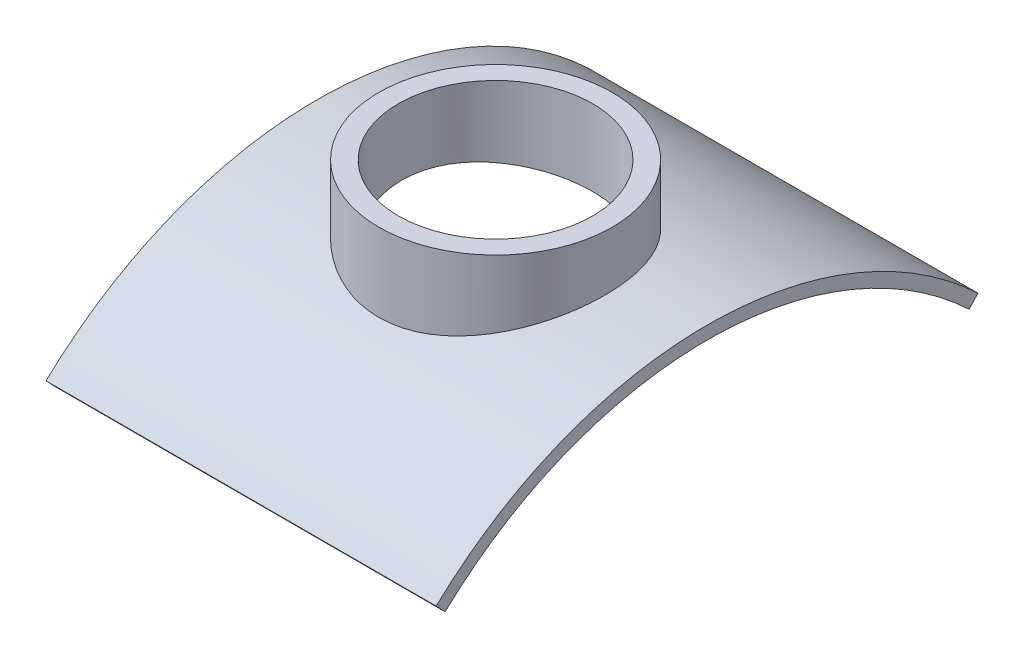
ISO-10303-21;
HEADER;
FILE_DESCRIPTION(('STEP AP214'),'2;1');
FILE_NAME('part.step','',(''),(''),'','','');
FILE_SCHEMA(('AUTOMOTIVE_DESIGN { 1 0 10303 214 1 1 1 1 }'));
ENDSEC;
DATA;
#1=APPLICATION_CONTEXT('core data for automotive mechanical design processes');
#2=APPLICATION_PROTOCOL_DEFINITION('international standard','automotive_design',2000,#1);
#3=PRODUCT_CONTEXT('',#1,'mechanical');
#4=PRODUCT('Part','Part','',(#3));
#5=PRODUCT_RELATED_PRODUCT_CATEGORY('part','',(#4));
#6=PRODUCT_DEFINITION_FORMATION('','',#4);
#7=PRODUCT_DEFINITION_CONTEXT('part definition',#1,'design');
#8=PRODUCT_DEFINITION('design','',#6,#7);
#9=PRODUCT_DEFINITION_SHAPE('','',#8);
#10=(LENGTH_UNIT() NAMED_UNIT(*) SI_UNIT(.MILLI.,.METRE.));
#11=(NAMED_UNIT(*) PLANE_ANGLE_UNIT() SI_UNIT($,.RADIAN.));
#12=(NAMED_UNIT(*) SI_UNIT($,.STERADIAN.) SOLID_ANGLE_UNIT());
#13=UNCERTAINTY_MEASURE_WITH_UNIT(LENGTH_MEASURE(1.E-05),#10,'distance_accuracy_value','');
#14=(GEOMETRIC_REPRESENTATION_CONTEXT(3) GLOBAL_UNCERTAINTY_ASSIGNED_CONTEXT((#13)) GLOBAL_UNIT_ASSIGNED_CONTEXT((#10,
#11,#12)) REPRESENTATION_CONTEXT('',''));
#15=CARTESIAN_POINT('',(0.,0.,0.));
#16=DIRECTION('',(0.,0.,1.));
#17=DIRECTION('',(1.,0.,0.));
#18=AXIS2_PLACEMENT_3D('',#15,#16,#17);
#19=CARTESIAN_POINT('',(-76.2,-55.8967886761865,-12.5367072563237));
#20=DIRECTION('',(1.,0.,0.));
#21=DIRECTION('',(0.,0.,-1.));
#22=AXIS2_PLACEMENT_3D('',#19,#20,#21);
#23=CYLINDRICAL_SURFACE('',#22,74.4279989622607);
#24=CARTESIAN_POINT('',(-37.9311273784649,15.0923870754284,9.82540256436644));
#25=CARTESIAN_POINT('',(-38.4505120344371,15.0923885511749,9.82540037968779));
#26=CARTESIAN_POINT('',(-38.9699386174354,15.099118057699,9.80406909682286));
#27=CARTESIAN_POINT('',(-40.0049848916022,15.1258511632332,9.71893493880602));
#28=CARTESIAN_POINT('',(-40.5206041648063,15.1458561983459,9.65512746871877));
#29=CARTESIAN_POINT('',(-41.5445096050084,15.1985944193553,9.48558610992453));
#30=CARTESIAN_POINT('',(-42.0527919175702,15.2313340597718,9.37983095954742));
#31=CARTESIAN_POINT('',(-43.0581299706054,15.308641800082,9.12734364837541));
#32=CARTESIAN_POINT('',(-43.5551859601273,15.3532096372948,8.98061239757524));
#33=CARTESIAN_POINT('',(-44.533843079493,15.4528961738092,8.64771169589109));
#34=CARTESIAN_POINT('',(-45.0154693640861,15.5079965603796,8.46161063742949));
#35=CARTESIAN_POINT('',(-45.9610188747538,15.6273752836008,8.05131394989079));
#36=CARTESIAN_POINT('',(-46.4249420292329,15.6916536573642,7.8271181667703));
#37=CARTESIAN_POINT('',(-47.3322033191304,15.8277900321173,7.34230665968545));
#38=CARTESIAN_POINT('',(-47.7755406796854,15.8996483180873,7.08168956627621));
#39=CARTESIAN_POINT('',(-48.6389285908967,16.0492127683249,6.52589267372035));
#40=CARTESIAN_POINT('',(-49.0589786620969,16.1269190529178,6.23071216334519));
#41=CARTESIAN_POINT('',(-49.8847538998985,16.2886172229573,5.59898621292399));
#42=CARTESIAN_POINT('',(-50.2897514943191,16.3727240375883,5.26151584603086));
#43=CARTESIAN_POINT('',(-50.874857797633,16.5005691496078,4.73125988836466));
#44=CARTESIAN_POINT('',(-51.0661710729505,16.5434673144236,4.55048930849967));
#45=CARTESIAN_POINT('',(-51.4411307242,16.6295954138362,4.1811458289045));
#46=CARTESIAN_POINT('',(-51.6247752275127,16.6728254264506,3.99257104560874));
#47=CARTESIAN_POINT('',(-52.1636855415677,16.8026227021649,3.4156570699129));
#48=CARTESIAN_POINT('',(-52.5069989707127,16.8893128093795,3.01606405696631));
#49=CARTESIAN_POINT('',(-53.1593911126859,17.0610330022589,2.18950719418521));
#50=CARTESIAN_POINT('',(-53.4684697359047,17.1460630835781,1.76254327271211));
#51=CARTESIAN_POINT('',(-53.9086986762779,17.2720529627238,1.09782169252944));
#52=CARTESIAN_POINT('',(-54.0532468445526,17.3143244279064,0.869089947443553));
#53=CARTESIAN_POINT('',(-54.3324907288905,17.3976871254553,0.405560696303036));
#54=CARTESIAN_POINT('',(-54.467188831338,17.438778642214,0.170764678223352));
#55=CARTESIAN_POINT('',(-54.8561989156189,17.5599536219544,-0.542279814024978));
#56=CARTESIAN_POINT('',(-55.0954515667016,17.6379446922613,-1.02922230745042));
#57=CARTESIAN_POINT('',(-55.5317064927699,17.7865460873568,-2.02264517109605));
#58=CARTESIAN_POINT('',(-55.7287124459112,17.8571570544102,-2.52912383589022));
#59=CARTESIAN_POINT('',(-56.078865446134,17.9894883899983,-3.55817125684371));
#60=CARTESIAN_POINT('',(-56.232013594514,18.0512089817568,-4.0807396086153));
#61=CARTESIAN_POINT('',(-56.490661966092,18.1634464348037,-5.12852526702309));
#62=CARTESIAN_POINT('',(-56.5969778951666,18.2141465983675,-5.65352165714116));
#63=CARTESIAN_POINT('',(-56.7649469985714,18.3048033508456,-6.71153483716751));
#64=CARTESIAN_POINT('',(-56.8266005805439,18.3447600378158,-7.24455155382731));
#65=CARTESIAN_POINT('',(-56.9045650427563,18.4132884767062,-8.31452796166626));
#66=CARTESIAN_POINT('',(-56.9208838522913,18.4418622188156,-8.85148694684651));
#67=CARTESIAN_POINT('',(-56.9079194025465,18.4873265932094,-9.92534575374575));
#68=CARTESIAN_POINT('',(-56.8786371380824,18.5042174803509,-10.4622455764999));
#69=CARTESIAN_POINT('',(-56.7762172578917,18.5260069975981,-11.5153011534834));
#70=CARTESIAN_POINT('',(-56.7044643574971,18.5312604506641,-12.031584818623));
#71=CARTESIAN_POINT('',(-56.5187566866084,18.5311593991978,-13.0564937221246));
#72=CARTESIAN_POINT('',(-56.4048028729502,18.5258051351658,-13.5651191338526));
#73=CARTESIAN_POINT('',(-56.1355354128616,18.5051029316497,-14.5710813614478));
#74=CARTESIAN_POINT('',(-55.9802221407807,18.4897550826168,-15.0684182794442));
#75=CARTESIAN_POINT('',(-55.6293965694005,18.4499398053579,-16.0483270023317));
#76=CARTESIAN_POINT('',(-55.4338839214881,18.4254722980438,-16.5308986791354));
#77=CARTESIAN_POINT('',(-55.0043585850204,18.3685531407903,-17.4774145512233));
#78=CARTESIAN_POINT('',(-54.7703909610917,18.3361108145879,-17.9413797686268));
#79=CARTESIAN_POINT('',(-54.2654838123821,18.2645165389867,-18.8481829077863));
#80=CARTESIAN_POINT('',(-53.9945444348608,18.2253646163123,-19.2910209136832));
#81=CARTESIAN_POINT('',(-53.4175536787451,18.1417858141443,-20.1527401925277));
#82=CARTESIAN_POINT('',(-53.1114982398656,18.0973583246441,-20.5716186867555));
#83=CARTESIAN_POINT('',(-52.466371588776,18.0047825365558,-21.382691898051));
#84=CARTESIAN_POINT('',(-52.1272997585278,17.9566341683196,-21.7748861153786));
#85=CARTESIAN_POINT('',(-51.4099530318163,17.8570700259727,-22.5390750499057));
#86=CARTESIAN_POINT('',(-51.0309386046624,17.8056038217391,-22.9103692849331));
#87=CARTESIAN_POINT('',(-50.243205223572,17.7022460221225,-23.6199244057623));
#88=CARTESIAN_POINT('',(-49.8344858187497,17.6503544202931,-23.9581847899674));
#89=CARTESIAN_POINT('',(-48.9900400720576,17.547907634141,-24.5994215613395));
#90=CARTESIAN_POINT('',(-48.5543118308208,17.4973525441644,-24.9023954627002));
#91=CARTESIAN_POINT('',(-47.6587764211411,17.3992935602198,-25.4709490955922));
#92=CARTESIAN_POINT('',(-47.1989692195455,17.3517896704531,-25.7365287756361));
#93=CARTESIAN_POINT('',(-46.253355224173,17.2609622800665,-26.2310275911407));
#94=CARTESIAN_POINT('',(-45.7673240045782,17.2176885869962,-26.4595269972308));
#95=CARTESIAN_POINT('',(-44.7771995812265,17.1374086754368,-26.8746912274126));
#96=CARTESIAN_POINT('',(-44.2731062118521,17.1004025144345,-27.0613556677927));
#97=CARTESIAN_POINT('',(-43.250506666591,17.0339618518025,-27.3913703389722));
#98=CARTESIAN_POINT('',(-42.732002161337,17.0045264765412,-27.5347255677761));
#99=CARTESIAN_POINT('',(-41.6843028043315,16.9542663956188,-27.7769873766069));
#100=CARTESIAN_POINT('',(-41.1551081509188,16.9334415303569,-27.8758947805033));
#101=CARTESIAN_POINT('',(-40.0989691752023,16.9014195701705,-28.0271488825383));
#102=CARTESIAN_POINT('',(-39.572138302375,16.8900655216584,-28.0802551377846));
#103=CARTESIAN_POINT('',(-38.5157646400974,16.8767921086345,-28.1422827296662));
#104=CARTESIAN_POINT('',(-37.9862218795402,16.874872643813,-28.1512045360764));
#105=CARTESIAN_POINT('',(-36.9283287148847,16.8805351128879,-28.1247908285501));
#106=CARTESIAN_POINT('',(-36.3999782353926,16.8881164281184,-28.0894581963473));
#107=CARTESIAN_POINT('',(-35.3482866785701,16.9125153750374,-27.9748320460118));
#108=CARTESIAN_POINT('',(-34.8249455800871,16.9293329677073,-27.8955387135914));
#109=CARTESIAN_POINT('',(-33.7936434107195,16.9713521273483,-27.6949203885937));
#110=CARTESIAN_POINT('',(-33.2855714298572,16.9964445335431,-27.5741418463194));
#111=CARTESIAN_POINT('',(-32.2815052041102,17.0542213709244,-27.2912988973857));
#112=CARTESIAN_POINT('',(-31.785510834766,17.0869057238394,-27.1292349163691));
#113=CARTESIAN_POINT('',(-30.8089153706347,17.1587833070525,-26.7650191457853));
#114=CARTESIAN_POINT('',(-30.3283154842383,17.1979770468191,-26.5628642181901));
#115=CARTESIAN_POINT('',(-29.3857282035648,17.2815811992814,-26.1199313142985));
#116=CARTESIAN_POINT('',(-28.9237410952908,17.3259916920964,-25.8791527447963));
#117=CARTESIAN_POINT('',(-28.0148960766911,17.4192439622062,-25.3569148090976));
#118=CARTESIAN_POINT('',(-27.5683512789683,17.4681402805285,-25.0749202149636));
#119=CARTESIAN_POINT('',(-26.7004618552449,17.5681694201977,-24.4748581224405));
#120=CARTESIAN_POINT('',(-26.2791174378193,17.6193022600495,-24.1567903255487));
#121=CARTESIAN_POINT('',(-25.464362502753,17.7220941647655,-23.4866842228816));
#122=CARTESIAN_POINT('',(-25.0709548874681,17.7737532836693,-23.1346423964788));
#123=CARTESIAN_POINT('',(-24.3147302528805,17.8758438147379,-22.3989389283633));
#124=CARTESIAN_POINT('',(-23.9519134853167,17.9262752167972,-22.0152770264935));
#125=CARTESIAN_POINT('',(-23.2537938953395,18.0249529282205,-21.2124925047506));
#126=CARTESIAN_POINT('',(-22.9190220616838,18.0731515710262,-20.792901986133));
#127=CARTESIAN_POINT('',(-22.2859732300946,18.1647213345024,-19.9265296762043));
#128=CARTESIAN_POINT('',(-21.9876966905665,18.2080923945345,-19.4797475434538));
#129=CARTESIAN_POINT('',(-21.4298622143547,18.2883417926831,-18.5621131399086));
#130=CARTESIAN_POINT('',(-21.1703015041661,18.3252205959226,-18.0912625965622));
#131=CARTESIAN_POINT('',(-20.6918558444932,18.3909788388864,-17.12879257837));
#132=CARTESIAN_POINT('',(-20.4729702096992,18.4198584133887,-16.6371734536127));
#133=CARTESIAN_POINT('',(-20.0800160341386,18.468011077339,-15.6428714111437));
#134=CARTESIAN_POINT('',(-19.9054302396058,18.4873977585535,-15.1403984378994));
#135=CARTESIAN_POINT('',(-19.5989713497572,18.5160610702586,-14.1223050121844));
#136=CARTESIAN_POINT('',(-19.4670979702088,18.5253377680279,-13.6066846472285));
#137=CARTESIAN_POINT('',(-19.247103608817,18.5330224256828,-12.5661874834342));
#138=CARTESIAN_POINT('',(-19.1589763794222,18.5314319380313,-12.041312017445));
#139=CARTESIAN_POINT('',(-19.0271000922027,18.516927988955,-10.9861736026338));
#140=CARTESIAN_POINT('',(-18.9833503234528,18.5040147089271,-10.4559107402552));
#141=CARTESIAN_POINT('',(-18.9409788157227,18.4671582971994,-9.40623547323372));
#142=CARTESIAN_POINT('',(-18.9413404424909,18.4434761774833,-8.88685459386633));
#143=CARTESIAN_POINT('',(-18.9845367521736,18.3853466957588,-7.85047754859901));
#144=CARTESIAN_POINT('',(-19.0273706932631,18.3508995217809,-7.33348134120666));
#145=CARTESIAN_POINT('',(-19.1550363463157,18.2717013697407,-6.30550473736014));
#146=CARTESIAN_POINT('',(-19.2398682218192,18.2269503515555,-5.79452436433964));
#147=CARTESIAN_POINT('',(-19.4507327666446,18.1278801743337,-4.78208494019542));
#148=CARTESIAN_POINT('',(-19.5767658975428,18.0735609081075,-4.28062599580652));
#149=CARTESIAN_POINT('',(-19.8695743285571,17.9560896857028,-3.2884632695043));
#150=CARTESIAN_POINT('',(-20.0365209840017,17.8929010709627,-2.79781443550404));
#151=CARTESIAN_POINT('',(-20.4095353693327,17.7590882932147,-1.83268018440445));
#152=CARTESIAN_POINT('',(-20.615603087386,17.6884641324558,-1.35819476241616));
#153=CARTESIAN_POINT('',(-21.0653502584784,17.54117950958,-0.428300531204531));
#154=CARTESIAN_POINT('',(-21.309034843561,17.4645182245224,0.0271056642583809));
#155=CARTESIAN_POINT('',(-21.8322929232475,17.3067324917072,0.915999408316385));
#156=CARTESIAN_POINT('',(-22.1118672397831,17.2256079417581,1.34948645461125));
#157=CARTESIAN_POINT('',(-22.714439868648,17.057975923983,2.20525428355844));
#158=CARTESIAN_POINT('',(-23.0385308258428,16.9713793674913,2.62674865733578));
#159=CARTESIAN_POINT('',(-23.7207935864139,16.7971871029441,3.44097367208228));
#160=CARTESIAN_POINT('',(-24.0789661638454,16.7095913722353,3.83370365940165));
#161=CARTESIAN_POINT('',(-24.8271941985643,16.5354007659577,4.58797815980594));
#162=CARTESIAN_POINT('',(-25.2172581333794,16.4488061635423,4.94951432794885));
#163=CARTESIAN_POINT('',(-26.0267307539892,16.278696536934,5.63889302066259));
#164=CARTESIAN_POINT('',(-26.4461393569215,16.1951815040462,5.96673564036955));
#165=CARTESIAN_POINT('',(-27.3191708983688,16.031871466393,6.59183347191292));
#166=CARTESIAN_POINT('',(-27.7732604063965,15.9521658758486,6.88846100497309));
#167=CARTESIAN_POINT('',(-28.7061116109241,15.8001437491203,7.44226703109749));
#168=CARTESIAN_POINT('',(-29.1848745174972,15.72782757586,7.69944358687803));
#169=CARTESIAN_POINT('',(-30.1634177853172,15.592608073624,8.17207321792282));
#170=CARTESIAN_POINT('',(-30.6631826521667,15.529697956164,8.3875564172319));
#171=CARTESIAN_POINT('',(-31.6804529571891,15.4150141210028,8.77513742347617));
#172=CARTESIAN_POINT('',(-32.1979554159355,15.3632385435311,8.94724247656663));
#173=CARTESIAN_POINT('',(-33.1442284788971,15.2812191881682,9.21723438644863));
#174=CARTESIAN_POINT('',(-33.570562544629,15.248744767584,9.32305327903275));
#175=CARTESIAN_POINT('',(-34.4302284115227,15.1925902282645,9.50498807735661));
#176=CARTESIAN_POINT('',(-34.8635619189554,15.1689122886884,9.58109662316537));
#177=CARTESIAN_POINT('',(-35.7348271602298,15.1308385489681,9.70306095797787));
#178=CARTESIAN_POINT('',(-36.1727584232947,15.1164418077374,9.7489198142232));
#179=CARTESIAN_POINT('',(-37.0508259670445,15.097216744675,9.81008739556817));
#180=CARTESIAN_POINT('',(-37.4909616164516,15.0923858247695,9.82540441582803));
#181=CARTESIAN_POINT('',(-37.9311273784649,15.0923870754284,9.82540256436644));
#182=B_SPLINE_CURVE_WITH_KNOTS('',3,(#24,#25,#26,#27,#28,#29,#30,#31,#32,#33,#34,#35,#36,#37,
#38,#39,#40,#41,#42,#43,#44,#45,#46,#47,#48,#49,#50,#51,#52,#53,#54,#55,#56,#57,#58,#59,#60,#61,
#62,#63,#64,#65,#66,#67,#68,#69,#70,#71,#72,#73,#74,#75,#76,#77,#78,#79,#80,#81,#82,#83,#84,#85,
#86,#87,#88,#89,#90,#91,#92,#93,#94,#95,#96,#97,#98,#99,#100,#101,#102,#103,#104,#105,#106,#107,
#108,#109,#110,#111,#112,#113,#114,#115,#116,#117,#118,#119,#120,#121,#122,#123,#124,#125,#126,
#127,#128,#129,#130,#131,#132,#133,#134,#135,#136,#137,#138,#139,#140,#141,#142,#143,#144,#145,
#146,#147,#148,#149,#150,#151,#152,#153,#154,#155,#156,#157,#158,#159,#160,#161,#162,#163,#164,
#165,#166,#167,#168,#169,#170,#171,#172,#173,#174,#175,#176,#177,#178,#179,#180,#181),
.UNSPECIFIED.,.T.,.F.,(4,2,2,2,2,2,2,2,2,2,2,2,2,2,2,2,2,2,2,2,2,2,2,2,2,2,2,2,2,2,2,2,2,2,2,2,
2,2,2,2,2,2,2,2,2,2,2,2,2,2,2,2,2,2,2,2,2,2,2,2,2,2,2,2,2,2,2,2,2,2,2,2,2,2,2,2,2,2,4),(0.,
1.55774722567019,3.11566299074126,4.67436941468636,6.23304122572705,7.78902725799899,
9.34501958235045,10.9010704279158,12.4571532987386,14.0566894465091,14.8565420972004,
15.6565889333576,17.2563929615333,18.8562011770882,19.6775614366018,20.4987220405953,
22.1409067595757,23.7829484457065,25.4249488954634,27.0370945008224,28.6492253916163,
30.2610742943035,31.8728880339954,33.4348393390948,34.9967552317018,36.5586569877042,
38.1205722892511,39.6806700955549,41.2407616881208,42.8010338479794,44.3613352203958,
45.9586745397057,47.5560381097683,49.1535141404025,50.7509923705491,52.3654524777662,
53.9799273922524,55.5942159205671,57.2084745257524,58.795417416949,60.3823434355254,
61.9691661229869,63.5559821069562,65.1226506078021,66.6893029573306,68.2560779814496,
69.8228770713743,71.4122080008891,73.0015520829361,74.5910610411871,76.1805830785784,
77.7954514792336,79.4103401616361,81.0251131018473,82.6398588332626,84.2347792758907,
85.8296891047964,87.4243710930774,89.0190275342089,90.5769390723734,92.1348234004114,
93.6927137949173,95.2506216430116,96.8151693552402,98.3797165942346,99.944477472297,
101.509274192256,103.123495302938,104.737753084248,106.352441379964,107.967125116367,
109.609758152778,111.25247182669,112.893994147845,114.535242076895,115.855560423404,
117.176205635657,118.496716917252,119.81686949921),.UNSPECIFIED.);
#183=CARTESIAN_POINT('',(-37.9311273784649,15.0923870754284,9.82540256436644));
#184=VERTEX_POINT('',#183);
#185=EDGE_CURVE('E117',#184,#184,#182,.T.);
#186=ORIENTED_EDGE('',*,*,#185,.F.);
#187=EDGE_LOOP('',(#186));
#188=FACE_BOUND('',#187,.T.);
#189=CARTESIAN_POINT('',(0.,-55.8967886761865,-12.5367072563237));
#190=DIRECTION('',(1.,0.,0.));
#191=DIRECTION('',(0.,0.,-1.));
#192=AXIS2_PLACEMENT_3D('',#189,#190,#191);
#193=CIRCLE('',#192,74.4279989622607);
#194=CARTESIAN_POINT('',(0.,-1.84463472029627,38.6286294693837));
#195=VERTEX_POINT('',#194);
#196=CARTESIAN_POINT('',(0.,-1.84463472029628,-63.7020439820311));
#197=VERTEX_POINT('',#196);
#198=EDGE_CURVE('E98',#195,#197,#193,.F.);
#199=ORIENTED_EDGE('',*,*,#198,.F.);
#200=DIRECTION('',(1.,0.,0.));
#201=VECTOR('',#200,1.);
#202=CARTESIAN_POINT('',(-76.2,-1.84463472029627,38.6286294693837));
#203=LINE('',#202,#201);
#204=CARTESIAN_POINT('',(-76.2,-1.84463472029627,38.6286294693837));
#205=VERTEX_POINT('',#204);
#206=EDGE_CURVE('E11',#205,#195,#203,.T.);
#207=ORIENTED_EDGE('',*,*,#206,.F.);
#208=CARTESIAN_POINT('',(-76.2,-55.8967886761865,-12.5367072563237));
#209=DIRECTION('',(1.,0.,0.));
#210=DIRECTION('',(0.,0.,-1.));
#211=AXIS2_PLACEMENT_3D('',#208,#209,#210);
#212=CIRCLE('',#211,74.4279989622607);
#213=CARTESIAN_POINT('',(-76.2,-1.84463472029628,-63.7020439820311));
#214=VERTEX_POINT('',#213);
#215=EDGE_CURVE('E92',#205,#214,#212,.F.);
#216=ORIENTED_EDGE('',*,*,#215,.T.);
#217=DIRECTION('',(1.,0.,0.));
#218=VECTOR('',#217,1.);
#219=CARTESIAN_POINT('',(-76.2,-1.84463472029628,-63.7020439820311));
#220=LINE('',#219,#218);
#221=EDGE_CURVE('E35',#214,#197,#220,.T.);
#222=ORIENTED_EDGE('',*,*,#221,.T.);
#223=EDGE_LOOP('',(#199,#207,#216,#222));
#224=FACE_BOUND('',#223,.T.);
#225=ADVANCED_FACE('F31',(#188,#224),#23,.F.);
#226=CARTESIAN_POINT('',(-76.2,-1.84463472029627,38.6286294693837));
#227=DIRECTION('',(0.,0.687447431599648,-0.726234141848927));
#228=DIRECTION('',(0.,0.726234141848927,0.687447431599648));
#229=AXIS2_PLACEMENT_3D('',#226,#227,#228);
#230=PLANE('',#229);
#231=DIRECTION('',(0.,0.726234141848927,0.687447431599648));
#232=VECTOR('',#231,1.);
#233=CARTESIAN_POINT('',(0.,-1.84463472029627,38.6286294693837));
#234=LINE('',#233,#232);
#235=CARTESIAN_POINT('',(0.,0.,40.3747459456468));
#236=VERTEX_POINT('',#235);
#237=EDGE_CURVE('E65',#195,#236,#234,.T.);
#238=ORIENTED_EDGE('',*,*,#237,.T.);
#239=DIRECTION('',(1.,0.,0.));
#240=VECTOR('',#239,1.);
#241=CARTESIAN_POINT('',(-76.2,0.,40.3747459456468));
#242=LINE('',#241,#240);
#243=CARTESIAN_POINT('',(-76.2,0.,40.3747459456468));
#244=VERTEX_POINT('',#243);
#245=EDGE_CURVE('E41',#244,#236,#242,.T.);
#246=ORIENTED_EDGE('',*,*,#245,.F.);
#247=DIRECTION('',(0.,0.726234141848927,0.687447431599648));
#248=VECTOR('',#247,1.);
#249=CARTESIAN_POINT('',(-76.2,-1.84463472029627,38.6286294693837));
#250=LINE('',#249,#248);
#251=EDGE_CURVE('E80',#205,#244,#250,.T.);
#252=ORIENTED_EDGE('',*,*,#251,.F.);
#253=ORIENTED_EDGE('',*,*,#206,.T.);
#254=EDGE_LOOP('',(#238,#246,#252,#253));
#255=FACE_BOUND('',#254,.T.);
#256=ADVANCED_FACE('F109',(#255),#230,.F.);
#257=CARTESIAN_POINT('',(-76.2,-55.8967886761865,-12.5367072563237));
#258=DIRECTION('',(1.,0.,0.));
#259=DIRECTION('',(0.,0.,-1.));
#260=AXIS2_PLACEMENT_3D('',#257,#258,#259);
#261=CYLINDRICAL_SURFACE('',#260,76.9679989622607);
#262=CARTESIAN_POINT('',(-37.9311273784649,16.4836563342776,13.6385490816225));
#263=CARTESIAN_POINT('',(-37.3120340167892,16.4836573943407,13.6385477192494));
#264=CARTESIAN_POINT('',(-36.6929172122809,16.4927993774697,13.6133082373263));
#265=CARTESIAN_POINT('',(-35.4593028522514,16.5290996100201,13.5125997505489));
#266=CARTESIAN_POINT('',(-34.844805532252,16.5562587718211,13.4371282019709));
#267=CARTESIAN_POINT('',(-33.6247638410043,16.6278089148961,13.2366687650529));
#268=CARTESIAN_POINT('',(-33.0192224423114,16.6722054898528,13.1116648027652));
#269=CARTESIAN_POINT('',(-31.8215986583262,16.7769587125027,12.8133273528378));
#270=CARTESIAN_POINT('',(-31.2295161909949,16.8373152628834,12.6399941598747));
#271=CARTESIAN_POINT('',(-30.0640252116612,16.9721742721701,12.2469593244261));
#272=CARTESIAN_POINT('',(-29.4905801848217,17.046646837991,12.0273555600766));
#273=CARTESIAN_POINT('',(-28.3647123270333,17.2078440571306,11.5433787861211));
#274=CARTESIAN_POINT('',(-27.8122894975938,17.294568711329,11.2790057733006));
#275=CARTESIAN_POINT('',(-26.7317337296797,17.4780760868483,10.7074775220971));
#276=CARTESIAN_POINT('',(-26.2036030989771,17.5748597609464,10.4003182301148));
#277=CARTESIAN_POINT('',(-25.1746853431473,17.77613064227,9.74537424831637));
#278=CARTESIAN_POINT('',(-24.673899976031,17.8806183437703,9.39758695105166));
#279=CARTESIAN_POINT('',(-23.6849650621474,18.0987203121613,8.65041941040612));
#280=CARTESIAN_POINT('',(-23.1979212731699,18.212527780105,8.24963154515162));
#281=CARTESIAN_POINT('',(-22.2590598366014,18.4430535883558,7.40948065113936));
#282=CARTESIAN_POINT('',(-21.8072429134864,18.559771988464,6.97011682942318));
#283=CARTESIAN_POINT('',(-20.9414585336366,18.7934172118496,6.05546449684313));
#284=CARTESIAN_POINT('',(-20.5274985803084,18.9103440717827,5.58016889810742));
#285=CARTESIAN_POINT('',(-19.7400449425774,19.1417395315159,4.59651374939352));
#286=CARTESIAN_POINT('',(-19.366550498807,19.256208177414,4.08815482016182));
#287=CARTESIAN_POINT('',(-18.8326420407276,19.4260155062698,3.29442197185762));
#288=CARTESIAN_POINT('',(-18.6564417320574,19.4832098916569,3.01993976428395));
#289=CARTESIAN_POINT('',(-18.3158745501409,19.5959106147482,2.46348616557056));
#290=CARTESIAN_POINT('',(-18.1515048981296,19.6514173470647,2.18151655449957));
#291=CARTESIAN_POINT('',(-17.6765300501747,19.8149446801022,1.32489308409025));
#292=CARTESIAN_POINT('',(-17.3840288896237,19.9199820563071,0.739479891604409));
#293=CARTESIAN_POINT('',(-16.8499472775929,20.1195832136438,-0.455681254793847));
#294=CARTESIAN_POINT('',(-16.6083604319404,20.2141483092486,-1.0654261415104));
#295=CARTESIAN_POINT('',(-16.1781709723903,20.3906900509596,-2.3051234606078));
#296=CARTESIAN_POINT('',(-15.9895665414161,20.4726671287388,-2.93507519915185));
#297=CARTESIAN_POINT('',(-15.6711880047396,20.6203756435108,-4.19473055626796));
#298=CARTESIAN_POINT('',(-15.5400728313138,20.6864590792568,-4.82405408766581));
#299=CARTESIAN_POINT('',(-15.3313339297806,20.8036418895826,-6.09289839030335));
#300=CARTESIAN_POINT('',(-15.2537095126311,20.8547414571726,-6.7324190300802));
#301=CARTESIAN_POINT('',(-15.1528678981915,20.9410672601067,-8.01665803009056));
#302=CARTESIAN_POINT('',(-15.1296382949597,20.97629711341,-8.66137517148094));
#303=CARTESIAN_POINT('',(-15.1379565127637,21.0304771833061,-9.95113463383163));
#304=CARTESIAN_POINT('',(-15.169502784327,21.0494278603735,-10.5961769450777));
#305=CARTESIAN_POINT('',(-15.2848867072863,21.0706731392162,-11.8558402417308));
#306=CARTESIAN_POINT('',(-15.3665862509614,21.0736025520237,-12.470647563088));
#307=CARTESIAN_POINT('',(-15.5797736504854,21.0649682336793,-13.6914480859489));
#308=CARTESIAN_POINT('',(-15.7112600258712,21.0534049334595,-14.2974415489854));
#309=CARTESIAN_POINT('',(-16.0230178729439,21.0166258310483,-15.4963071143186));
#310=CARTESIAN_POINT('',(-16.2032889874107,20.9914101288235,-16.0891793126596));
#311=CARTESIAN_POINT('',(-16.611230469141,20.9285161990604,-17.2577014240113));
#312=CARTESIAN_POINT('',(-16.8389014164655,20.8908378190053,-17.833351126161));
#313=CARTESIAN_POINT('',(-17.3398666045758,20.8045232427067,-18.9634264505148));
#314=CARTESIAN_POINT('',(-17.6131509152556,20.7558894306751,-19.5178566600132));
#315=CARTESIAN_POINT('',(-18.2033834785741,20.649408358881,-20.6020229613198));
#316=CARTESIAN_POINT('',(-18.520331539148,20.5915611396454,-21.1317591617365));
#317=CARTESIAN_POINT('',(-19.1957322590028,20.468593741768,-22.1632908288531));
#318=CARTESIAN_POINT('',(-19.5541912379611,20.4034724557662,-22.6650820239023));
#319=CARTESIAN_POINT('',(-20.3101854953758,20.2680639969101,-23.6375700971771));
#320=CARTESIAN_POINT('',(-20.7077217373487,20.1977766966897,-24.1082662082217));
#321=CARTESIAN_POINT('',(-21.5528180829599,20.0519073889261,-25.0304414096823));
#322=CARTESIAN_POINT('',(-22.0015824983683,19.9762275916155,-25.4808019944471));
#323=CARTESIAN_POINT('',(-22.9350811796576,19.8241858465534,-26.3424426713212));
#324=CARTESIAN_POINT('',(-23.4198161909814,19.7478238846939,-26.7537219531195));
#325=CARTESIAN_POINT('',(-24.4221623967654,19.5968922047949,-27.5345468768791));
#326=CARTESIAN_POINT('',(-24.9397771626881,19.5223226826705,-27.9040879730052));
#327=CARTESIAN_POINT('',(-26.0044884320937,19.3774119871134,-28.5988853786419));
#328=CARTESIAN_POINT('',(-26.551585006033,19.3070708237864,-28.9241415823129));
#329=CARTESIAN_POINT('',(-27.6800359479324,19.171927443375,-29.532569601811));
#330=CARTESIAN_POINT('',(-28.2617790396538,19.1072232640332,-29.8150428893236));
#331=CARTESIAN_POINT('',(-29.4479602144835,18.98676874822,-30.3298416095335));
#332=CARTESIAN_POINT('',(-30.0523985895601,18.9310185269876,-30.5621663968249));
#333=CARTESIAN_POINT('',(-31.2795713444778,18.8304268729881,-30.9747452951541));
#334=CARTESIAN_POINT('',(-31.9023025438752,18.7855835563493,-31.1550083994437));
#335=CARTESIAN_POINT('',(-33.161585815169,18.7083868884382,-31.4619745337428));
#336=CARTESIAN_POINT('',(-33.7981375080319,18.676033195088,-31.5886790306768));
#337=CARTESIAN_POINT('',(-35.0647738726444,18.6255962504717,-31.7850066703411));
#338=CARTESIAN_POINT('',(-35.6946436131427,18.6071873114856,-31.8559341338842));
#339=CARTESIAN_POINT('',(-36.9583498856843,18.5840093357285,-31.9451006687858));
#340=CARTESIAN_POINT('',(-37.5921863569503,18.5792400904838,-31.9633405454394));
#341=CARTESIAN_POINT('',(-38.8590650295545,18.583507602097,-31.9469724803683));
#342=CARTESIAN_POINT('',(-39.4921073026698,18.5925430054767,-31.912369719606));
#343=CARTESIAN_POINT('',(-40.7527748523144,18.6241025361672,-31.7906309947995));
#344=CARTESIAN_POINT('',(-41.380400167891,18.6466265661647,-31.7034954097514));
#345=CARTESIAN_POINT('',(-42.6134520551104,18.7038166400641,-31.4796632096166));
#346=CARTESIAN_POINT('',(-43.2190726710482,18.7382363608885,-31.3439701907282));
#347=CARTESIAN_POINT('',(-44.4165473499051,18.818158004007,-31.0239131488236));
#348=CARTESIAN_POINT('',(-45.0084016298216,18.8636597514863,-30.8395498935586));
#349=CARTESIAN_POINT('',(-46.174470157775,18.9642782735849,-30.423553663998));
#350=CARTESIAN_POINT('',(-46.7486826438701,19.0193960049354,-30.1919159857991));
#351=CARTESIAN_POINT('',(-47.8757129895233,19.1374898400657,-29.6830795816641));
#352=CARTESIAN_POINT('',(-48.4285303962558,19.200466110052,-29.4058798920615));
#353=CARTESIAN_POINT('',(-49.5198875322,19.3335967534668,-28.8019891732347));
#354=CARTESIAN_POINT('',(-50.0579356093846,19.4038675512592,-28.4744352055469));
#355=CARTESIAN_POINT('',(-51.1047447177186,19.5482711648942,-27.7762233162897));
#356=CARTESIAN_POINT('',(-51.6135054349266,19.6224040221194,-27.4055649327976));
#357=CARTESIAN_POINT('',(-52.5985946578325,19.7721801144736,-26.6235274834425));
#358=CARTESIAN_POINT('',(-53.0749181546046,19.8478235805478,-26.2121421525199));
#359=CARTESIAN_POINT('',(-53.9920152866302,19.9981992522352,-25.3513292250056));
#360=CARTESIAN_POINT('',(-54.4327884348992,20.0729314453535,-24.9019011074597));
#361=CARTESIAN_POINT('',(-55.2863991920833,20.2208982521016,-23.9562187560015));
#362=CARTESIAN_POINT('',(-55.6982703761372,20.2940494979533,-23.4590784057275));
#363=CARTESIAN_POINT('',(-56.4787492667761,20.4343502779015,-22.4311069879917));
#364=CARTESIAN_POINT('',(-56.84735615118,20.5014996979355,-21.9002752805652));
#365=CARTESIAN_POINT('',(-57.5385531576028,20.6273992172431,-20.8085499068129));
#366=CARTESIAN_POINT('',(-57.8611467392008,20.6861499479856,-20.2476585049372));
#367=CARTESIAN_POINT('',(-58.4578470944738,20.7930573087024,-19.0996817188724));
#368=CARTESIAN_POINT('',(-58.7319549037631,20.841214164958,-18.5125968944876));
#369=CARTESIAN_POINT('',(-59.2260643731121,20.9244200154626,-17.3246495902829));
#370=CARTESIAN_POINT('',(-59.4467558259986,20.9596395452877,-16.7240860452416));
#371=CARTESIAN_POINT('',(-59.8370300083598,21.016332981375,-15.5059329009933));
#372=CARTESIAN_POINT('',(-60.0066130755547,21.0378069784678,-14.8883434143218));
#373=CARTESIAN_POINT('',(-60.2932461384207,21.0658177649531,-13.6408842386414));
#374=CARTESIAN_POINT('',(-60.4103067578548,21.0723575761924,-13.0110170599717));
#375=CARTESIAN_POINT('',(-60.5910069674732,21.0697330987488,-11.7437032327275));
#376=CARTESIAN_POINT('',(-60.6546478699127,21.0605691958446,-11.1062567707281));
#377=CARTESIAN_POINT('',(-60.7268898840939,21.0267693668496,-9.84943998092273));
#378=CARTESIAN_POINT('',(-60.7372090752246,21.0026448584167,-9.23015388184072));
#379=CARTESIAN_POINT('',(-60.7075081828247,20.9395047807029,-7.99356615162516));
#380=CARTESIAN_POINT('',(-60.6674893167024,20.9004895715644,-7.37626447286106));
#381=CARTESIAN_POINT('',(-60.5376255622268,20.8080806519828,-6.14803117129677));
#382=CARTESIAN_POINT('',(-60.4477813456828,20.7546871354115,-5.53709946272159));
#383=CARTESIAN_POINT('',(-60.2191863547861,20.6344108944806,-4.32581145040937));
#384=CARTESIAN_POINT('',(-60.0804350182009,20.5675280150522,-3.72545526833107));
#385=CARTESIAN_POINT('',(-59.7551749420364,20.4214506616469,-2.53886488795041));
#386=CARTESIAN_POINT('',(-59.5686293619162,20.3422467089805,-1.95264196688018));
#387=CARTESIAN_POINT('',(-59.1494070255971,20.1731046386917,-0.798548300339725));
#388=CARTESIAN_POINT('',(-58.9167304429304,20.0831665614486,-0.230677485843223));
#389=CARTESIAN_POINT('',(-58.4070005978278,19.8943347953573,0.883341661253812));
#390=CARTESIAN_POINT('',(-58.1299402768577,19.795439683123,1.42948652140896));
#391=CARTESIAN_POINT('',(-57.5334565502384,19.590716874648,2.49674572038262));
#392=CARTESIAN_POINT('',(-57.2140319091418,19.4848889762759,3.01785932862452));
#393=CARTESIAN_POINT('',(-56.521448884816,19.2641847635278,4.05218694486825));
#394=CARTESIAN_POINT('',(-56.1466672781533,19.1491161759652,4.56427736023137));
#395=CARTESIAN_POINT('',(-55.5538472817198,18.974637774398,5.30726086788122));
#396=CARTESIAN_POINT('',(-55.3511202209543,18.9161623243718,5.55074321654528));
#397=CARTESIAN_POINT('',(-54.9356849928906,18.7988964326393,6.02907112894569));
#398=CARTESIAN_POINT('',(-54.7229744019199,18.7401059175462,6.26391457049865));
#399=CARTESIAN_POINT('',(-54.070369338484,18.5637771586447,6.95490469533555));
#400=CARTESIAN_POINT('',(-53.6159911127936,18.4462785960584,7.39752428824431));
#401=CARTESIAN_POINT('',(-52.6715125467978,18.2142092104481,8.24370223710413));
#402=CARTESIAN_POINT('',(-52.1814122902647,18.099638380559,8.64726068465314));
#403=CARTESIAN_POINT('',(-51.4147427751548,17.9305419273636,9.22656714403167));
#404=CARTESIAN_POINT('',(-51.1501560562157,17.8738952875975,9.41771283447779));
#405=CARTESIAN_POINT('',(-50.6128190824242,17.7625019243622,9.78859777608197));
#406=CARTESIAN_POINT('',(-50.3400708167685,17.707754744854,9.9683397738467));
#407=CARTESIAN_POINT('',(-49.510053202377,17.5468883745314,10.4900531429101));
#408=CARTESIAN_POINT('',(-48.9409782218379,17.4441370436702,10.8145366926826));
#409=CARTESIAN_POINT('',(-47.7757760472583,17.2506223780548,11.41383148951));
#410=CARTESIAN_POINT('',(-47.1796635830092,17.1598526187832,11.6886693859291));
#411=CARTESIAN_POINT('',(-45.9641999968617,16.9928919077664,12.1864869390039));
#412=CARTESIAN_POINT('',(-45.344851777213,16.9166991424929,12.4094730473008));
#413=CARTESIAN_POINT('',(-44.1698755293691,16.7900985944882,12.7757739675921));
#414=CARTESIAN_POINT('',(-43.6165198916912,16.7376210497925,12.9256971330606));
#415=CARTESIAN_POINT('',(-42.4990125959693,16.6466986560175,13.1835969850137));
#416=CARTESIAN_POINT('',(-41.9348620458188,16.608252374938,13.2915779521001));
#417=CARTESIAN_POINT('',(-40.7993242666901,16.5463505823411,13.4646947996988));
#418=CARTESIAN_POINT('',(-40.2279385454999,16.5228919982078,13.5298394621283));
#419=CARTESIAN_POINT('',(-39.0814179254423,16.4915438404077,13.6167687436144));
#420=CARTESIAN_POINT('',(-38.5062827686375,16.4836553494489,13.638550347306));
#421=CARTESIAN_POINT('',(-37.9311273784649,16.4836563342776,13.6385490816225));
#422=B_SPLINE_CURVE_WITH_KNOTS('',3,(#262,#263,#264,#265,#266,#267,#268,#269,#270,#271,#272,
#273,#274,#275,#276,#277,#278,#279,#280,#281,#282,#283,#284,#285,#286,#287,#288,#289,#290,#291,
#292,#293,#294,#295,#296,#297,#298,#299,#300,#301,#302,#303,#304,#305,#306,#307,#308,#309,#310,
#311,#312,#313,#314,#315,#316,#317,#318,#319,#320,#321,#322,#323,#324,#325,#326,#327,#328,#329,
#330,#331,#332,#333,#334,#335,#336,#337,#338,#339,#340,#341,#342,#343,#344,#345,#346,#347,#348,
#349,#350,#351,#352,#353,#354,#355,#356,#357,#358,#359,#360,#361,#362,#363,#364,#365,#366,#367,
#368,#369,#370,#371,#372,#373,#374,#375,#376,#377,#378,#379,#380,#381,#382,#383,#384,#385,#386,
#387,#388,#389,#390,#391,#392,#393,#394,#395,#396,#397,#398,#399,#400,#401,#402,#403,#404,#405,
#406,#407,#408,#409,#410,#411,#412,#413,#414,#415,#416,#417,#418,#419,#420,#421),.UNSPECIFIED.,
.T.,.F.,(4,2,2,2,2,2,2,2,2,2,2,2,2,2,2,2,2,2,2,2,2,2,2,2,2,2,2,2,2,2,2,2,2,2,2,2,2,2,2,2,2,2,2,
2,2,2,2,2,2,2,2,2,2,2,2,2,2,2,2,2,2,2,2,2,2,2,2,2,2,2,2,2,2,2,2,2,2,2,2,4),(0.,1.85674196563154,
3.71357796279599,5.57101702285044,7.42844475783819,9.28198214917371,11.1355196735927,
12.9892329229236,14.8430652064118,16.7637058744631,18.6843860320065,20.6054460548682,
22.5264700212519,23.5196471137755,24.5125901640673,26.4983126247453,28.4837855558236,
30.4691903851205,32.4054344145201,34.3416535016886,36.2774309481898,38.2131536372774,
40.0715894390362,41.9299699826192,43.7883369188097,45.6467265983202,47.5047122297076,
49.3626896885929,51.2209503812212,53.0792569039279,54.997838178484,56.9164592242019,
58.8352890317991,60.754123425269,62.701521054528,64.648943745098,66.5960298320255,
68.5430625864733,70.4430858460478,72.3430800648624,74.2428880104832,76.1426822501718,
78.005286211252,79.8678607923423,81.7306207939121,83.5934201991582,85.4927014062778,
87.3920029686684,89.2915971575107,91.1912173634153,93.1380446319999,95.0849088914898,
97.0316266958278,98.9783029149284,100.898310259851,102.818304917234,104.737911040294,
106.65747000686,108.51477502085,110.372035117425,112.229270172643,114.086526579187,
115.945218917462,117.803904263974,119.662885499089,121.52192095858,123.454331125218,
124.420646686064,125.387198062331,127.320249798679,129.253297001932,130.246891468522,
131.240245709841,133.226829274264,135.2123432679,137.197610082285,138.92298631989,
140.648186420081,142.37303272477,144.097998967021),.UNSPECIFIED.);
#423=CARTESIAN_POINT('',(-37.9311273784649,16.4836563342776,13.6385490816225));
#424=VERTEX_POINT('',#423);
#425=EDGE_CURVE('E102',#424,#424,#422,.T.);
#426=ORIENTED_EDGE('',*,*,#425,.F.);
#427=EDGE_LOOP('',(#426));
#428=FACE_BOUND('',#427,.T.);
#429=CARTESIAN_POINT('',(0.,-55.8967886761865,-12.5367072563237));
#430=DIRECTION('',(-1.,0.,0.));
#431=DIRECTION('',(0.,0.,1.));
#432=AXIS2_PLACEMENT_3D('',#429,#430,#431);
#433=CIRCLE('',#432,76.9679989622607);
#434=CARTESIAN_POINT('',(0.,0.,-65.4481604582942));
#435=VERTEX_POINT('',#434);
#436=EDGE_CURVE('E87',#236,#435,#433,.T.);
#437=ORIENTED_EDGE('',*,*,#436,.T.);
#438=DIRECTION('',(1.,0.,0.));
#439=VECTOR('',#438,1.);
#440=CARTESIAN_POINT('',(-76.2,0.,-65.4481604582942));
#441=LINE('',#440,#439);
#442=CARTESIAN_POINT('',(-76.2,0.,-65.4481604582942));
#443=VERTEX_POINT('',#442);
#444=EDGE_CURVE('E84',#443,#435,#441,.T.);
#445=ORIENTED_EDGE('',*,*,#444,.F.);
#446=CARTESIAN_POINT('',(-76.2,-55.8967886761865,-12.5367072563237));
#447=DIRECTION('',(-1.,0.,0.));
#448=DIRECTION('',(0.,0.,1.));
#449=AXIS2_PLACEMENT_3D('',#446,#447,#448);
#450=CIRCLE('',#449,76.9679989622607);
#451=EDGE_CURVE('E77',#244,#443,#450,.T.);
#452=ORIENTED_EDGE('',*,*,#451,.F.);
#453=ORIENTED_EDGE('',*,*,#245,.T.);
#454=EDGE_LOOP('',(#437,#445,#452,#453));
#455=FACE_BOUND('',#454,.T.);
#456=ADVANCED_FACE('F85',(#428,#455),#261,.T.);
#457=CARTESIAN_POINT('',(-76.2,0.,-65.4481604582942));
#458=DIRECTION('',(0.,0.687447431599647,0.726234141848928));
#459=DIRECTION('',(0.,-0.726234141848928,0.687447431599647));
#460=AXIS2_PLACEMENT_3D('',#457,#458,#459);
#461=PLANE('',#460);
#462=DIRECTION('',(0.,-0.726234141848928,0.687447431599647));
#463=VECTOR('',#462,1.);
#464=CARTESIAN_POINT('',(0.,0.,-65.4481604582942));
#465=LINE('',#464,#463);
#466=EDGE_CURVE('E101',#435,#197,#465,.T.);
#467=ORIENTED_EDGE('',*,*,#466,.T.);
#468=ORIENTED_EDGE('',*,*,#221,.F.);
#469=DIRECTION('',(0.,-0.726234141848928,0.687447431599647));
#470=VECTOR('',#469,1.);
#471=CARTESIAN_POINT('',(-76.2,0.,-65.4481604582942));
#472=LINE('',#471,#470);
#473=EDGE_CURVE('E74',#443,#214,#472,.T.);
#474=ORIENTED_EDGE('',*,*,#473,.F.);
#475=ORIENTED_EDGE('',*,*,#444,.T.);
#476=EDGE_LOOP('',(#467,#468,#474,#475));
#477=FACE_BOUND('',#476,.T.);
#478=ADVANCED_FACE('F91',(#477),#461,.F.);
#479=CARTESIAN_POINT('',(-76.2,-55.8967886761865,-12.5367072563237));
#480=DIRECTION('',(1.,0.,0.));
#481=DIRECTION('',(0.,0.,-1.));
#482=AXIS2_PLACEMENT_3D('',#479,#480,#481);
#483=PLANE('',#482);
#484=ORIENTED_EDGE('',*,*,#215,.F.);
#485=ORIENTED_EDGE('',*,*,#251,.T.);
#486=ORIENTED_EDGE('',*,*,#451,.T.);
#487=ORIENTED_EDGE('',*,*,#473,.T.);
#488=EDGE_LOOP('',(#484,#485,#486,#487));
#489=FACE_BOUND('',#488,.T.);
#490=ADVANCED_FACE('F79',(#489),#483,.F.);
#491=CARTESIAN_POINT('',(0.,-55.8967886761865,-12.5367072563237));
#492=DIRECTION('',(1.,0.,0.));
#493=DIRECTION('',(0.,0.,-1.));
#494=AXIS2_PLACEMENT_3D('',#491,#492,#493);
#495=PLANE('',#494);
#496=ORIENTED_EDGE('',*,*,#198,.T.);
#497=ORIENTED_EDGE('',*,*,#466,.F.);
#498=ORIENTED_EDGE('',*,*,#436,.F.);
#499=ORIENTED_EDGE('',*,*,#237,.F.);
#500=EDGE_LOOP('',(#496,#497,#498,#499));
#501=FACE_BOUND('',#500,.T.);
#502=ADVANCED_FACE('F107',(#501),#495,.T.);
#503=CARTESIAN_POINT('',(-37.9311273784649,31.75,-9.15925482562084));
#504=DIRECTION('',(0.,1.,0.));
#505=DIRECTION('',(0.,0.,1.));
#506=AXIS2_PLACEMENT_3D('',#503,#504,#505);
#507=PLANE('',#506);
#508=CARTESIAN_POINT('',(-37.9311273784649,31.75,-9.15925482562084));
#509=DIRECTION('',(0.,1.,0.));
#510=DIRECTION('',(0.,0.,1.));
#511=AXIS2_PLACEMENT_3D('',#508,#509,#510);
#512=CIRCLE('',#511,18.9846573899873);
#513=CARTESIAN_POINT('',(-37.9311273784649,31.75,9.82540256436644));
#514=VERTEX_POINT('',#513);
#515=EDGE_CURVE('E120',#514,#514,#512,.T.);
#516=ORIENTED_EDGE('',*,*,#515,.F.);
#517=EDGE_LOOP('',(#516));
#518=FACE_BOUND('',#517,.T.);
#519=CARTESIAN_POINT('',(-37.9311273784649,31.75,-9.15925482562084));
#520=DIRECTION('',(0.,1.,0.));
#521=DIRECTION('',(0.,0.,1.));
#522=AXIS2_PLACEMENT_3D('',#519,#520,#521);
#523=CIRCLE('',#522,22.7978039072434);
#524=CARTESIAN_POINT('',(-37.9311273784649,31.75,13.6385490816225));
#525=VERTEX_POINT('',#524);
#526=EDGE_CURVE('E119',#525,#525,#523,.T.);
#527=ORIENTED_EDGE('',*,*,#526,.T.);
#528=EDGE_LOOP('',(#527));
#529=FACE_BOUND('',#528,.T.);
#530=ADVANCED_FACE('F134',(#518,#529),#507,.T.);
#531=CARTESIAN_POINT('',(-37.9311273784649,-500000.,-9.15925482562084));
#532=DIRECTION('',(0.,1.,0.));
#533=DIRECTION('',(0.,0.,1.));
#534=AXIS2_PLACEMENT_3D('',#531,#532,#533);
#535=CYLINDRICAL_SURFACE('',#534,22.7978039072434);
#536=ORIENTED_EDGE('',*,*,#526,.F.);
#537=EDGE_LOOP('',(#536));
#538=FACE_BOUND('',#537,.T.);
#539=ORIENTED_EDGE('',*,*,#425,.T.);
#540=EDGE_LOOP('',(#539));
#541=FACE_BOUND('',#540,.T.);
#542=ADVANCED_FACE('F133',(#538,#541),#535,.T.);
#543=CARTESIAN_POINT('',(-37.9311273784649,-44.45,-9.15925482562084));
#544=DIRECTION('',(0.,1.,0.));
#545=DIRECTION('',(0.,0.,1.));
#546=AXIS2_PLACEMENT_3D('',#543,#544,#545);
#547=CYLINDRICAL_SURFACE('',#546,18.9846573899873);
#548=ORIENTED_EDGE('',*,*,#185,.T.);
#549=EDGE_LOOP('',(#548));
#550=FACE_BOUND('',#549,.T.);
#551=ORIENTED_EDGE('',*,*,#515,.T.);
#552=EDGE_LOOP('',(#551));
#553=FACE_BOUND('',#552,.T.);
#554=ADVANCED_FACE('F129',(#550,#553),#547,.F.);
#555=CLOSED_SHELL('',(#225,#256,#456,#478,#490,#502,#530,#542,#554));
#556=MANIFOLD_SOLID_BREP('B2',#555);
#557=ADVANCED_BREP_SHAPE_REPRESENTATION('',(#18,#556),#14);
#558=SHAPE_DEFINITION_REPRESENTATION(#9,#557);
ENDSEC;
END-ISO-10303-21;
